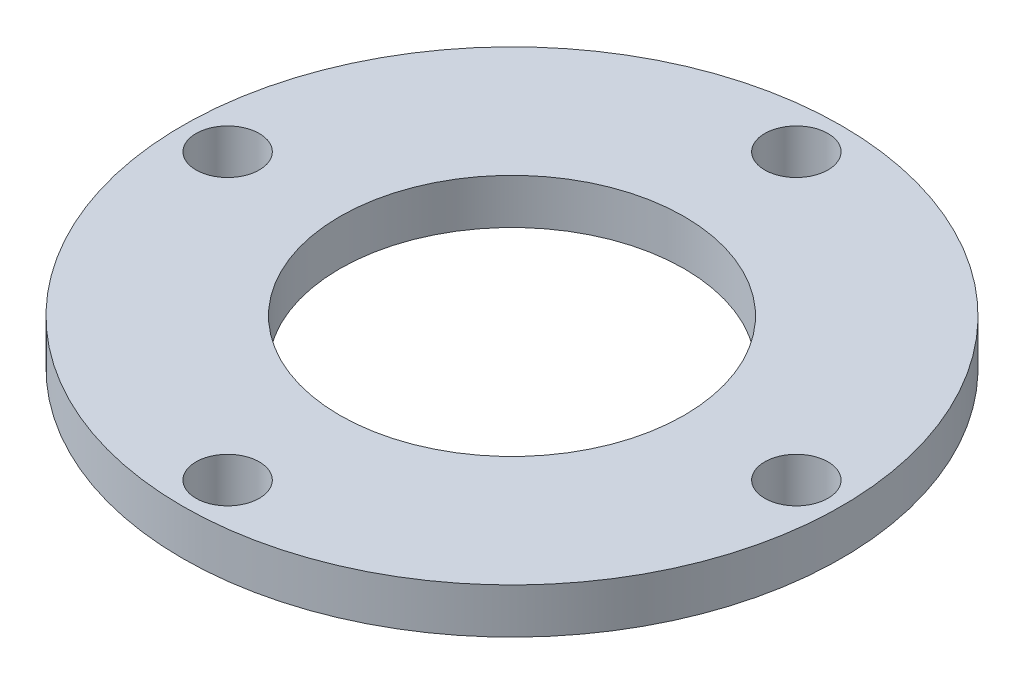
ISO-10303-21;
HEADER;
FILE_DESCRIPTION(('STEP AP214'),'2;1');
FILE_NAME('part.step','',(''),(''),'','','');
FILE_SCHEMA(('AUTOMOTIVE_DESIGN { 1 0 10303 214 1 1 1 1 }'));
ENDSEC;
DATA;
#1=APPLICATION_CONTEXT('core data for automotive mechanical design processes');
#2=APPLICATION_PROTOCOL_DEFINITION('international standard','automotive_design',2000,#1);
#3=PRODUCT_CONTEXT('',#1,'mechanical');
#4=PRODUCT('Part','Part','',(#3));
#5=PRODUCT_RELATED_PRODUCT_CATEGORY('part','',(#4));
#6=PRODUCT_DEFINITION_FORMATION('','',#4);
#7=PRODUCT_DEFINITION_CONTEXT('part definition',#1,'design');
#8=PRODUCT_DEFINITION('design','',#6,#7);
#9=PRODUCT_DEFINITION_SHAPE('','',#8);
#10=(LENGTH_UNIT() NAMED_UNIT(*) SI_UNIT(.MILLI.,.METRE.));
#11=(NAMED_UNIT(*) PLANE_ANGLE_UNIT() SI_UNIT($,.RADIAN.));
#12=(NAMED_UNIT(*) SI_UNIT($,.STERADIAN.) SOLID_ANGLE_UNIT());
#13=UNCERTAINTY_MEASURE_WITH_UNIT(LENGTH_MEASURE(1.E-05),#10,'distance_accuracy_value','');
#14=(GEOMETRIC_REPRESENTATION_CONTEXT(3) GLOBAL_UNCERTAINTY_ASSIGNED_CONTEXT((#13)) GLOBAL_UNIT_ASSIGNED_CONTEXT((#10,
#11,#12)) REPRESENTATION_CONTEXT('',''));
#15=CARTESIAN_POINT('',(0.,0.,0.));
#16=DIRECTION('',(0.,0.,1.));
#17=DIRECTION('',(1.,0.,0.));
#18=AXIS2_PLACEMENT_3D('',#15,#16,#17);
#19=CARTESIAN_POINT('',(0.,1.5,0.));
#20=DIRECTION('',(0.,1.,0.));
#21=DIRECTION('',(0.,0.,1.));
#22=AXIS2_PLACEMENT_3D('',#19,#20,#21);
#23=PLANE('',#22);
#24=CARTESIAN_POINT('',(0.,1.5,9.4375));
#25=DIRECTION('',(0.,1.,0.));
#26=DIRECTION('',(0.,0.,1.));
#27=AXIS2_PLACEMENT_3D('',#24,#25,#26);
#28=CIRCLE('',#27,1.05);
#29=CARTESIAN_POINT('',(0.,1.5,10.4875));
#30=VERTEX_POINT('',#29);
#31=EDGE_CURVE('E58',#30,#30,#28,.T.);
#32=ORIENTED_EDGE('',*,*,#31,.F.);
#33=EDGE_LOOP('',(#32));
#34=FACE_BOUND('',#33,.T.);
#35=CARTESIAN_POINT('',(0.,1.5,-9.4375));
#36=DIRECTION('',(0.,1.,0.));
#37=DIRECTION('',(0.,0.,1.));
#38=AXIS2_PLACEMENT_3D('',#35,#36,#37);
#39=CIRCLE('',#38,1.05);
#40=CARTESIAN_POINT('',(0.,1.5,-8.3875));
#41=VERTEX_POINT('',#40);
#42=EDGE_CURVE('E46',#41,#41,#39,.T.);
#43=ORIENTED_EDGE('',*,*,#42,.F.);
#44=EDGE_LOOP('',(#43));
#45=FACE_BOUND('',#44,.T.);
#46=CARTESIAN_POINT('',(0.,1.5,0.));
#47=DIRECTION('',(0.,1.,0.));
#48=DIRECTION('',(0.,0.,1.));
#49=AXIS2_PLACEMENT_3D('',#46,#47,#48);
#50=CIRCLE('',#49,10.9375);
#51=CARTESIAN_POINT('',(0.,1.5,10.9375));
#52=VERTEX_POINT('',#51);
#53=EDGE_CURVE('E10',#52,#52,#50,.T.);
#54=ORIENTED_EDGE('',*,*,#53,.T.);
#55=EDGE_LOOP('',(#54));
#56=FACE_BOUND('',#55,.T.);
#57=CARTESIAN_POINT('',(0.,1.5,0.));
#58=DIRECTION('',(0.,1.,0.));
#59=DIRECTION('',(0.,0.,1.));
#60=AXIS2_PLACEMENT_3D('',#57,#58,#59);
#61=CIRCLE('',#60,5.715);
#62=CARTESIAN_POINT('',(0.,1.5,5.715));
#63=VERTEX_POINT('',#62);
#64=EDGE_CURVE('E41',#63,#63,#61,.T.);
#65=ORIENTED_EDGE('',*,*,#64,.F.);
#66=EDGE_LOOP('',(#65));
#67=FACE_BOUND('',#66,.T.);
#68=CARTESIAN_POINT('',(9.4375,1.5,0.));
#69=DIRECTION('',(0.,1.,0.));
#70=DIRECTION('',(0.,0.,1.));
#71=AXIS2_PLACEMENT_3D('',#68,#69,#70);
#72=CIRCLE('',#71,1.05);
#73=CARTESIAN_POINT('',(9.4375,1.5,1.05));
#74=VERTEX_POINT('',#73);
#75=EDGE_CURVE('E52',#74,#74,#72,.T.);
#76=ORIENTED_EDGE('',*,*,#75,.F.);
#77=EDGE_LOOP('',(#76));
#78=FACE_BOUND('',#77,.T.);
#79=CARTESIAN_POINT('',(-9.4375,1.5,0.));
#80=DIRECTION('',(0.,1.,0.));
#81=DIRECTION('',(0.,0.,1.));
#82=AXIS2_PLACEMENT_3D('',#79,#80,#81);
#83=CIRCLE('',#82,1.05);
#84=CARTESIAN_POINT('',(-9.4375,1.5,1.05));
#85=VERTEX_POINT('',#84);
#86=EDGE_CURVE('E64',#85,#85,#83,.T.);
#87=ORIENTED_EDGE('',*,*,#86,.F.);
#88=EDGE_LOOP('',(#87));
#89=FACE_BOUND('',#88,.T.);
#90=ADVANCED_FACE('F30',(#34,#45,#56,#67,#78,#89),#23,.T.);
#91=CARTESIAN_POINT('',(0.,0.,0.));
#92=DIRECTION('',(0.,1.,0.));
#93=DIRECTION('',(0.,0.,1.));
#94=AXIS2_PLACEMENT_3D('',#91,#92,#93);
#95=PLANE('',#94);
#96=CARTESIAN_POINT('',(0.,0.,0.));
#97=DIRECTION('',(0.,1.,0.));
#98=DIRECTION('',(0.,0.,1.));
#99=AXIS2_PLACEMENT_3D('',#96,#97,#98);
#100=CIRCLE('',#99,10.9375);
#101=CARTESIAN_POINT('',(0.,0.,10.9375));
#102=VERTEX_POINT('',#101);
#103=EDGE_CURVE('E34',#102,#102,#100,.T.);
#104=ORIENTED_EDGE('',*,*,#103,.F.);
#105=EDGE_LOOP('',(#104));
#106=FACE_BOUND('',#105,.T.);
#107=CARTESIAN_POINT('',(0.,0.,0.));
#108=DIRECTION('',(0.,1.,0.));
#109=DIRECTION('',(0.,0.,1.));
#110=AXIS2_PLACEMENT_3D('',#107,#108,#109);
#111=CIRCLE('',#110,5.715);
#112=CARTESIAN_POINT('',(0.,0.,5.715));
#113=VERTEX_POINT('',#112);
#114=EDGE_CURVE('E43',#113,#113,#111,.T.);
#115=ORIENTED_EDGE('',*,*,#114,.T.);
#116=EDGE_LOOP('',(#115));
#117=FACE_BOUND('',#116,.T.);
#118=CARTESIAN_POINT('',(0.,0.,-9.4375));
#119=DIRECTION('',(0.,1.,0.));
#120=DIRECTION('',(0.,0.,1.));
#121=AXIS2_PLACEMENT_3D('',#118,#119,#120);
#122=CIRCLE('',#121,1.05);
#123=CARTESIAN_POINT('',(0.,0.,-8.3875));
#124=VERTEX_POINT('',#123);
#125=EDGE_CURVE('E49',#124,#124,#122,.T.);
#126=ORIENTED_EDGE('',*,*,#125,.T.);
#127=EDGE_LOOP('',(#126));
#128=FACE_BOUND('',#127,.T.);
#129=CARTESIAN_POINT('',(9.4375,0.,0.));
#130=DIRECTION('',(0.,1.,0.));
#131=DIRECTION('',(0.,0.,1.));
#132=AXIS2_PLACEMENT_3D('',#129,#130,#131);
#133=CIRCLE('',#132,1.05);
#134=CARTESIAN_POINT('',(9.4375,0.,1.05));
#135=VERTEX_POINT('',#134);
#136=EDGE_CURVE('E55',#135,#135,#133,.T.);
#137=ORIENTED_EDGE('',*,*,#136,.T.);
#138=EDGE_LOOP('',(#137));
#139=FACE_BOUND('',#138,.T.);
#140=CARTESIAN_POINT('',(0.,0.,9.4375));
#141=DIRECTION('',(0.,1.,0.));
#142=DIRECTION('',(0.,0.,1.));
#143=AXIS2_PLACEMENT_3D('',#140,#141,#142);
#144=CIRCLE('',#143,1.05);
#145=CARTESIAN_POINT('',(0.,0.,10.4875));
#146=VERTEX_POINT('',#145);
#147=EDGE_CURVE('E61',#146,#146,#144,.T.);
#148=ORIENTED_EDGE('',*,*,#147,.T.);
#149=EDGE_LOOP('',(#148));
#150=FACE_BOUND('',#149,.T.);
#151=CARTESIAN_POINT('',(-9.4375,0.,0.));
#152=DIRECTION('',(0.,1.,0.));
#153=DIRECTION('',(0.,0.,1.));
#154=AXIS2_PLACEMENT_3D('',#151,#152,#153);
#155=CIRCLE('',#154,1.05);
#156=CARTESIAN_POINT('',(-9.4375,0.,1.05));
#157=VERTEX_POINT('',#156);
#158=EDGE_CURVE('E67',#157,#157,#155,.T.);
#159=ORIENTED_EDGE('',*,*,#158,.T.);
#160=EDGE_LOOP('',(#159));
#161=FACE_BOUND('',#160,.T.);
#162=ADVANCED_FACE('F77',(#106,#117,#128,#139,#150,#161),#95,.F.);
#163=CARTESIAN_POINT('',(0.,1.5,0.));
#164=DIRECTION('',(0.,-1.,0.));
#165=DIRECTION('',(0.,0.,-1.));
#166=AXIS2_PLACEMENT_3D('',#163,#164,#165);
#167=CYLINDRICAL_SURFACE('',#166,10.9375);
#168=ORIENTED_EDGE('',*,*,#53,.F.);
#169=EDGE_LOOP('',(#168));
#170=FACE_BOUND('',#169,.T.);
#171=ORIENTED_EDGE('',*,*,#103,.T.);
#172=EDGE_LOOP('',(#171));
#173=FACE_BOUND('',#172,.T.);
#174=ADVANCED_FACE('F32',(#170,#173),#167,.T.);
#175=CARTESIAN_POINT('',(0.,1.5,0.));
#176=DIRECTION('',(0.,-1.,0.));
#177=DIRECTION('',(0.,0.,-1.));
#178=AXIS2_PLACEMENT_3D('',#175,#176,#177);
#179=CYLINDRICAL_SURFACE('',#178,5.715);
#180=ORIENTED_EDGE('',*,*,#64,.T.);
#181=EDGE_LOOP('',(#180));
#182=FACE_BOUND('',#181,.T.);
#183=ORIENTED_EDGE('',*,*,#114,.F.);
#184=EDGE_LOOP('',(#183));
#185=FACE_BOUND('',#184,.T.);
#186=ADVANCED_FACE('F87',(#182,#185),#179,.F.);
#187=CARTESIAN_POINT('',(0.,1.5,-9.4375));
#188=DIRECTION('',(0.,-1.,0.));
#189=DIRECTION('',(0.,0.,-1.));
#190=AXIS2_PLACEMENT_3D('',#187,#188,#189);
#191=CYLINDRICAL_SURFACE('',#190,1.05);
#192=ORIENTED_EDGE('',*,*,#42,.T.);
#193=EDGE_LOOP('',(#192));
#194=FACE_BOUND('',#193,.T.);
#195=ORIENTED_EDGE('',*,*,#125,.F.);
#196=EDGE_LOOP('',(#195));
#197=FACE_BOUND('',#196,.T.);
#198=ADVANCED_FACE('F90',(#194,#197),#191,.F.);
#199=CARTESIAN_POINT('',(9.4375,1.5,0.));
#200=DIRECTION('',(0.,-1.,0.));
#201=DIRECTION('',(0.,0.,-1.));
#202=AXIS2_PLACEMENT_3D('',#199,#200,#201);
#203=CYLINDRICAL_SURFACE('',#202,1.05);
#204=ORIENTED_EDGE('',*,*,#75,.T.);
#205=EDGE_LOOP('',(#204));
#206=FACE_BOUND('',#205,.T.);
#207=ORIENTED_EDGE('',*,*,#136,.F.);
#208=EDGE_LOOP('',(#207));
#209=FACE_BOUND('',#208,.T.);
#210=ADVANCED_FACE('F94',(#206,#209),#203,.F.);
#211=CARTESIAN_POINT('',(0.,1.5,9.4375));
#212=DIRECTION('',(0.,-1.,0.));
#213=DIRECTION('',(0.,0.,-1.));
#214=AXIS2_PLACEMENT_3D('',#211,#212,#213);
#215=CYLINDRICAL_SURFACE('',#214,1.05);
#216=ORIENTED_EDGE('',*,*,#31,.T.);
#217=EDGE_LOOP('',(#216));
#218=FACE_BOUND('',#217,.T.);
#219=ORIENTED_EDGE('',*,*,#147,.F.);
#220=EDGE_LOOP('',(#219));
#221=FACE_BOUND('',#220,.T.);
#222=ADVANCED_FACE('F98',(#218,#221),#215,.F.);
#223=CARTESIAN_POINT('',(-9.4375,1.5,0.));
#224=DIRECTION('',(0.,-1.,0.));
#225=DIRECTION('',(0.,0.,-1.));
#226=AXIS2_PLACEMENT_3D('',#223,#224,#225);
#227=CYLINDRICAL_SURFACE('',#226,1.05);
#228=ORIENTED_EDGE('',*,*,#86,.T.);
#229=EDGE_LOOP('',(#228));
#230=FACE_BOUND('',#229,.T.);
#231=ORIENTED_EDGE('',*,*,#158,.F.);
#232=EDGE_LOOP('',(#231));
#233=FACE_BOUND('',#232,.T.);
#234=ADVANCED_FACE('F73',(#230,#233),#227,.F.);
#235=CLOSED_SHELL('',(#90,#162,#174,#186,#198,#210,#222,#234));
#236=MANIFOLD_SOLID_BREP('B2',#235);
#237=ADVANCED_BREP_SHAPE_REPRESENTATION('',(#18,#236),#14);
#238=SHAPE_DEFINITION_REPRESENTATION(#9,#237);
ENDSEC;
END-ISO-10303-21;
